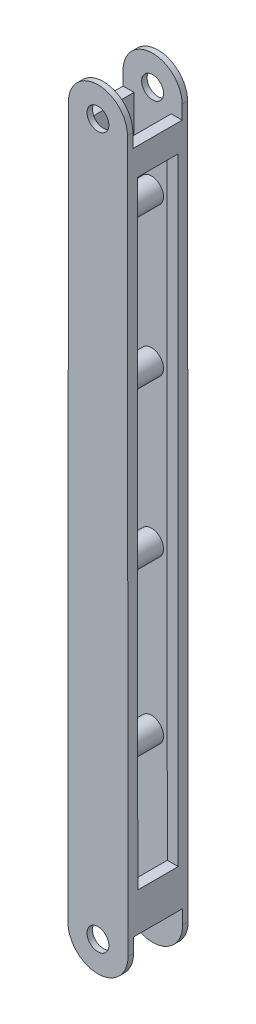
ISO-10303-21;
HEADER;
FILE_DESCRIPTION(('STEP AP214'),'2;1');
FILE_NAME('part.step','',(''),(''),'','','');
FILE_SCHEMA(('AUTOMOTIVE_DESIGN { 1 0 10303 214 1 1 1 1 }'));
ENDSEC;
DATA;
#1=APPLICATION_CONTEXT('core data for automotive mechanical design processes');
#2=APPLICATION_PROTOCOL_DEFINITION('international standard','automotive_design',2000,#1);
#3=PRODUCT_CONTEXT('',#1,'mechanical');
#4=PRODUCT('Part','Part','',(#3));
#5=PRODUCT_RELATED_PRODUCT_CATEGORY('part','',(#4));
#6=PRODUCT_DEFINITION_FORMATION('','',#4);
#7=PRODUCT_DEFINITION_CONTEXT('part definition',#1,'design');
#8=PRODUCT_DEFINITION('design','',#6,#7);
#9=PRODUCT_DEFINITION_SHAPE('','',#8);
#10=(LENGTH_UNIT() NAMED_UNIT(*) SI_UNIT(.MILLI.,.METRE.));
#11=(NAMED_UNIT(*) PLANE_ANGLE_UNIT() SI_UNIT($,.RADIAN.));
#12=(NAMED_UNIT(*) SI_UNIT($,.STERADIAN.) SOLID_ANGLE_UNIT());
#13=UNCERTAINTY_MEASURE_WITH_UNIT(LENGTH_MEASURE(1.E-05),#10,'distance_accuracy_value','');
#14=(GEOMETRIC_REPRESENTATION_CONTEXT(3) GLOBAL_UNCERTAINTY_ASSIGNED_CONTEXT((#13)) GLOBAL_UNIT_ASSIGNED_CONTEXT((#10,
#11,#12)) REPRESENTATION_CONTEXT('',''));
#15=CARTESIAN_POINT('',(0.,0.,0.));
#16=DIRECTION('',(0.,0.,1.));
#17=DIRECTION('',(1.,0.,0.));
#18=AXIS2_PLACEMENT_3D('',#15,#16,#17);
#19=CARTESIAN_POINT('',(17.4999896449765,0.0134615304961336,55.));
#20=DIRECTION('',(-0.999999704142143,-0.000769230541647676,0.));
#21=DIRECTION('',(0.000769230541647677,-0.999999704142143,0.));
#22=AXIS2_PLACEMENT_3D('',#19,#20,#21);
#23=PLANE('',#22);
#24=DIRECTION('',(-0.000769230541647677,0.999999704142143,0.));
#25=VECTOR('',#24,1.);
#26=CARTESIAN_POINT('',(17.4999896449765,0.0134615304961336,46.));
#27=LINE('',#26,#25);
#28=CARTESIAN_POINT('',(17.4628808729569,48.2548651560053,46.));
#29=VERTEX_POINT('',#28);
#30=CARTESIAN_POINT('',(17.0287913508929,612.571243839388,46.));
#31=VERTEX_POINT('',#30);
#32=EDGE_CURVE('E246',#29,#31,#27,.T.);
#33=ORIENTED_EDGE('',*,*,#32,.F.);
#34=DIRECTION('',(0.,0.,1.));
#35=VECTOR('',#34,1.);
#36=CARTESIAN_POINT('',(17.4628808729569,48.2548651560053,55.));
#37=LINE('',#36,#35);
#38=CARTESIAN_POINT('',(17.4628808729569,48.2548651560053,9.00000000000001));
#39=VERTEX_POINT('',#38);
#40=EDGE_CURVE('E212',#39,#29,#37,.T.);
#41=ORIENTED_EDGE('',*,*,#40,.F.);
#42=DIRECTION('',(0.000769230541647677,-0.999999704142143,0.));
#43=VECTOR('',#42,1.);
#44=CARTESIAN_POINT('',(17.4999896449765,0.0134615304961336,9.00000000000001));
#45=LINE('',#44,#43);
#46=CARTESIAN_POINT('',(17.0287913508928,612.571243839388,9.00000000000001));
#47=VERTEX_POINT('',#46);
#48=EDGE_CURVE('E229',#47,#39,#45,.T.);
#49=ORIENTED_EDGE('',*,*,#48,.F.);
#50=DIRECTION('',(0.,0.,-1.));
#51=VECTOR('',#50,1.);
#52=CARTESIAN_POINT('',(17.0287913508929,612.571243839388,55.));
#53=LINE('',#52,#51);
#54=EDGE_CURVE('E239',#31,#47,#53,.T.);
#55=ORIENTED_EDGE('',*,*,#54,.F.);
#56=EDGE_LOOP('',(#33,#41,#49,#55));
#57=FACE_BOUND('',#56,.T.);
#58=DIRECTION('',(0.,0.,-1.));
#59=VECTOR('',#58,1.);
#60=CARTESIAN_POINT('',(17.4900179488838,12.9766664510537,55.));
#61=LINE('',#60,#59);
#62=CARTESIAN_POINT('',(17.4900179488838,12.9766664510537,50.));
#63=VERTEX_POINT('',#62);
#64=CARTESIAN_POINT('',(17.4900179488838,12.9766664510537,5.));
#65=VERTEX_POINT('',#64);
#66=EDGE_CURVE('E322',#63,#65,#61,.T.);
#67=ORIENTED_EDGE('',*,*,#66,.F.);
#68=DIRECTION('',(-0.000769230541647677,0.999999704142143,0.));
#69=VECTOR('',#68,1.);
#70=CARTESIAN_POINT('',(17.4999896449765,0.0134615304961336,50.));
#71=LINE('',#70,#69);
#72=CARTESIAN_POINT('',(17.0096776403332,637.419067566951,50.));
#73=VERTEX_POINT('',#72);
#74=EDGE_CURVE('E291',#63,#73,#71,.T.);
#75=ORIENTED_EDGE('',*,*,#74,.T.);
#76=DIRECTION('',(0.,0.,-1.));
#77=VECTOR('',#76,1.);
#78=CARTESIAN_POINT('',(17.0096776403332,637.419067566951,55.));
#79=LINE('',#78,#77);
#80=CARTESIAN_POINT('',(17.0096776403332,637.419067566951,5.));
#81=VERTEX_POINT('',#80);
#82=EDGE_CURVE('E316',#73,#81,#79,.T.);
#83=ORIENTED_EDGE('',*,*,#82,.T.);
#84=DIRECTION('',(-0.000769230541647677,0.999999704142143,0.));
#85=VECTOR('',#84,1.);
#86=CARTESIAN_POINT('',(17.4999896449765,0.0134615304961336,5.));
#87=LINE('',#86,#85);
#88=EDGE_CURVE('E357',#65,#81,#87,.T.);
#89=ORIENTED_EDGE('',*,*,#88,.F.);
#90=EDGE_LOOP('',(#67,#75,#83,#89));
#91=FACE_BOUND('',#90,.T.);
#92=ADVANCED_FACE('F43',(#57,#91),#23,.T.);
#93=CARTESIAN_POINT('',(0.,12.9766664510537,55.));
#94=DIRECTION('',(0.,-1.,0.));
#95=DIRECTION('',(0.,0.,-1.));
#96=AXIS2_PLACEMENT_3D('',#93,#94,#95);
#97=PLANE('',#96);
#98=DIRECTION('',(0.,0.,-1.));
#99=VECTOR('',#98,1.);
#100=CARTESIAN_POINT('',(27.4900179488838,12.9766664510537,55.));
#101=LINE('',#100,#99);
#102=CARTESIAN_POINT('',(27.4900179488838,12.9766664510537,50.));
#103=VERTEX_POINT('',#102);
#104=CARTESIAN_POINT('',(27.4900179488838,12.9766664510537,5.));
#105=VERTEX_POINT('',#104);
#106=EDGE_CURVE('E320',#103,#105,#101,.T.);
#107=ORIENTED_EDGE('',*,*,#106,.F.);
#108=DIRECTION('',(-1.,0.,0.));
#109=VECTOR('',#108,1.);
#110=CARTESIAN_POINT('',(0.,12.9766664510537,50.));
#111=LINE('',#110,#109);
#112=EDGE_CURVE('E288',#103,#63,#111,.T.);
#113=ORIENTED_EDGE('',*,*,#112,.T.);
#114=ORIENTED_EDGE('',*,*,#66,.T.);
#115=DIRECTION('',(-1.,0.,0.));
#116=VECTOR('',#115,1.);
#117=CARTESIAN_POINT('',(0.,12.9766664510537,5.));
#118=LINE('',#117,#116);
#119=EDGE_CURVE('E354',#105,#65,#118,.T.);
#120=ORIENTED_EDGE('',*,*,#119,.F.);
#121=EDGE_LOOP('',(#107,#113,#114,#120));
#122=FACE_BOUND('',#121,.T.);
#123=ADVANCED_FACE('F488',(#122),#97,.T.);
#124=CARTESIAN_POINT('',(0.,637.419067566951,55.));
#125=DIRECTION('',(0.,-1.,0.));
#126=DIRECTION('',(0.,0.,-1.));
#127=AXIS2_PLACEMENT_3D('',#124,#125,#126);
#128=PLANE('',#127);
#129=DIRECTION('',(-1.,0.,0.));
#130=VECTOR('',#129,1.);
#131=CARTESIAN_POINT('',(0.,637.419067566951,50.));
#132=LINE('',#131,#130);
#133=CARTESIAN_POINT('',(27.0096776403331,637.419067566951,50.));
#134=VERTEX_POINT('',#133);
#135=EDGE_CURVE('E253',#134,#73,#132,.T.);
#136=ORIENTED_EDGE('',*,*,#135,.F.);
#137=DIRECTION('',(0.,0.,-1.));
#138=VECTOR('',#137,1.);
#139=CARTESIAN_POINT('',(27.0096776403331,637.419067566951,55.));
#140=LINE('',#139,#138);
#141=CARTESIAN_POINT('',(27.0096776403331,637.419067566951,5.));
#142=VERTEX_POINT('',#141);
#143=EDGE_CURVE('E318',#134,#142,#140,.T.);
#144=ORIENTED_EDGE('',*,*,#143,.T.);
#145=DIRECTION('',(-1.,0.,0.));
#146=VECTOR('',#145,1.);
#147=CARTESIAN_POINT('',(0.,637.419067566951,5.));
#148=LINE('',#147,#146);
#149=EDGE_CURVE('E360',#142,#81,#148,.T.);
#150=ORIENTED_EDGE('',*,*,#149,.T.);
#151=ORIENTED_EDGE('',*,*,#82,.F.);
#152=EDGE_LOOP('',(#136,#144,#150,#151));
#153=FACE_BOUND('',#152,.T.);
#154=ADVANCED_FACE('F478',(#153),#128,.F.);
#155=CARTESIAN_POINT('',(0.,637.419067566951,55.));
#156=DIRECTION('',(0.,1.,0.));
#157=DIRECTION('',(0.,0.,1.));
#158=AXIS2_PLACEMENT_3D('',#155,#156,#157);
#159=PLANE('',#158);
#160=DIRECTION('',(0.,0.,-1.));
#161=VECTOR('',#160,1.);
#162=CARTESIAN_POINT('',(-27.0096776403331,637.419067566951,55.));
#163=LINE('',#162,#161);
#164=CARTESIAN_POINT('',(-27.0096776403331,637.419067566951,50.));
#165=VERTEX_POINT('',#164);
#166=CARTESIAN_POINT('',(-27.0096776403331,637.419067566951,5.));
#167=VERTEX_POINT('',#166);
#168=EDGE_CURVE('E312',#165,#167,#163,.T.);
#169=ORIENTED_EDGE('',*,*,#168,.F.);
#170=DIRECTION('',(1.,0.,0.));
#171=VECTOR('',#170,1.);
#172=CARTESIAN_POINT('',(0.,637.419067566951,50.));
#173=LINE('',#172,#171);
#174=CARTESIAN_POINT('',(-17.0096776403332,637.419067566951,50.));
#175=VERTEX_POINT('',#174);
#176=EDGE_CURVE('E277',#165,#175,#173,.T.);
#177=ORIENTED_EDGE('',*,*,#176,.T.);
#178=DIRECTION('',(0.,0.,-1.));
#179=VECTOR('',#178,1.);
#180=CARTESIAN_POINT('',(-17.0096776403332,637.419067566951,55.));
#181=LINE('',#180,#179);
#182=CARTESIAN_POINT('',(-17.0096776403332,637.419067566951,5.));
#183=VERTEX_POINT('',#182);
#184=EDGE_CURVE('E306',#175,#183,#181,.T.);
#185=ORIENTED_EDGE('',*,*,#184,.T.);
#186=DIRECTION('',(1.,0.,0.));
#187=VECTOR('',#186,1.);
#188=CARTESIAN_POINT('',(0.,637.419067566951,5.));
#189=LINE('',#188,#187);
#190=EDGE_CURVE('E342',#167,#183,#189,.T.);
#191=ORIENTED_EDGE('',*,*,#190,.F.);
#192=EDGE_LOOP('',(#169,#177,#185,#191));
#193=FACE_BOUND('',#192,.T.);
#194=ADVANCED_FACE('F510',(#193),#159,.T.);
#195=CARTESIAN_POINT('',(0.,12.9766664510537,55.));
#196=DIRECTION('',(0.,1.,0.));
#197=DIRECTION('',(0.,0.,1.));
#198=AXIS2_PLACEMENT_3D('',#195,#196,#197);
#199=PLANE('',#198);
#200=DIRECTION('',(1.,0.,0.));
#201=VECTOR('',#200,1.);
#202=CARTESIAN_POINT('',(0.,12.9766664510537,50.));
#203=LINE('',#202,#201);
#204=CARTESIAN_POINT('',(-27.4900179488838,12.9766664510537,50.));
#205=VERTEX_POINT('',#204);
#206=CARTESIAN_POINT('',(-17.4900179488838,12.9766664510537,50.));
#207=VERTEX_POINT('',#206);
#208=EDGE_CURVE('E283',#205,#207,#203,.T.);
#209=ORIENTED_EDGE('',*,*,#208,.F.);
#210=DIRECTION('',(0.,0.,-1.));
#211=VECTOR('',#210,1.);
#212=CARTESIAN_POINT('',(-27.4900179488838,12.9766664510537,55.));
#213=LINE('',#212,#211);
#214=CARTESIAN_POINT('',(-27.4900179488838,12.9766664510537,5.));
#215=VERTEX_POINT('',#214);
#216=EDGE_CURVE('E310',#205,#215,#213,.T.);
#217=ORIENTED_EDGE('',*,*,#216,.T.);
#218=DIRECTION('',(1.,0.,0.));
#219=VECTOR('',#218,1.);
#220=CARTESIAN_POINT('',(0.,12.9766664510537,5.));
#221=LINE('',#220,#219);
#222=CARTESIAN_POINT('',(-17.4900179488838,12.9766664510537,5.));
#223=VERTEX_POINT('',#222);
#224=EDGE_CURVE('E349',#215,#223,#221,.T.);
#225=ORIENTED_EDGE('',*,*,#224,.T.);
#226=DIRECTION('',(0.,0.,-1.));
#227=VECTOR('',#226,1.);
#228=CARTESIAN_POINT('',(-17.4900179488838,12.9766664510537,55.));
#229=LINE('',#228,#227);
#230=EDGE_CURVE('E308',#207,#223,#229,.T.);
#231=ORIENTED_EDGE('',*,*,#230,.F.);
#232=EDGE_LOOP('',(#209,#217,#225,#231));
#233=FACE_BOUND('',#232,.T.);
#234=ADVANCED_FACE('F503',(#233),#199,.F.);
#235=CARTESIAN_POINT('',(-17.4999896449765,0.0134615304961336,55.));
#236=DIRECTION('',(-0.999999704142143,0.000769230541647676,0.));
#237=DIRECTION('',(-0.000769230541647677,-0.999999704142143,0.));
#238=AXIS2_PLACEMENT_3D('',#235,#236,#237);
#239=PLANE('',#238);
#240=DIRECTION('',(0.,0.,1.));
#241=VECTOR('',#240,1.);
#242=CARTESIAN_POINT('',(-17.4629015391004,48.2279991695345,55.));
#243=LINE('',#242,#241);
#244=CARTESIAN_POINT('',(-17.4629015391004,48.2279991695345,9.00000000000001));
#245=VERTEX_POINT('',#244);
#246=CARTESIAN_POINT('',(-17.4629015391004,48.2279991695345,46.));
#247=VERTEX_POINT('',#246);
#248=EDGE_CURVE('E204',#245,#247,#243,.T.);
#249=ORIENTED_EDGE('',*,*,#248,.T.);
#250=DIRECTION('',(0.000769230541647677,0.999999704142143,0.));
#251=VECTOR('',#250,1.);
#252=CARTESIAN_POINT('',(-17.4999896449765,0.0134615304961336,46.));
#253=LINE('',#252,#251);
#254=CARTESIAN_POINT('',(-17.0288115033206,612.545045683346,46.));
#255=VERTEX_POINT('',#254);
#256=EDGE_CURVE('E244',#247,#255,#253,.T.);
#257=ORIENTED_EDGE('',*,*,#256,.T.);
#258=DIRECTION('',(0.,0.,-1.));
#259=VECTOR('',#258,1.);
#260=CARTESIAN_POINT('',(-17.0288115033206,612.545045683346,55.));
#261=LINE('',#260,#259);
#262=CARTESIAN_POINT('',(-17.0288115033206,612.545045683346,9.00000000000001));
#263=VERTEX_POINT('',#262);
#264=EDGE_CURVE('E228',#255,#263,#261,.T.);
#265=ORIENTED_EDGE('',*,*,#264,.T.);
#266=DIRECTION('',(-0.000769230541647677,-0.999999704142143,0.));
#267=VECTOR('',#266,1.);
#268=CARTESIAN_POINT('',(-17.4999896449765,0.0134615304961336,9.00000000000001));
#269=LINE('',#268,#267);
#270=EDGE_CURVE('E218',#263,#245,#269,.T.);
#271=ORIENTED_EDGE('',*,*,#270,.T.);
#272=EDGE_LOOP('',(#249,#257,#265,#271));
#273=FACE_BOUND('',#272,.T.);
#274=DIRECTION('',(0.000769230541647677,0.999999704142143,0.));
#275=VECTOR('',#274,1.);
#276=CARTESIAN_POINT('',(-17.4999896449765,0.0134615304961336,50.));
#277=LINE('',#276,#275);
#278=EDGE_CURVE('E281',#207,#175,#277,.T.);
#279=ORIENTED_EDGE('',*,*,#278,.F.);
#280=ORIENTED_EDGE('',*,*,#230,.T.);
#281=DIRECTION('',(0.000769230541647677,0.999999704142143,0.));
#282=VECTOR('',#281,1.);
#283=CARTESIAN_POINT('',(-17.4999896449765,0.0134615304961336,5.));
#284=LINE('',#283,#282);
#285=EDGE_CURVE('E346',#223,#183,#284,.T.);
#286=ORIENTED_EDGE('',*,*,#285,.T.);
#287=ORIENTED_EDGE('',*,*,#184,.F.);
#288=EDGE_LOOP('',(#279,#280,#286,#287));
#289=FACE_BOUND('',#288,.T.);
#290=ADVANCED_FACE('F226',(#273,#289),#239,.F.);
#291=CARTESIAN_POINT('',(0.,650.,5.));
#292=DIRECTION('',(0.,0.,-1.));
#293=DIRECTION('',(-1.,0.,0.));
#294=AXIS2_PLACEMENT_3D('',#291,#292,#293);
#295=CYLINDRICAL_SURFACE('',#294,27.);
#296=CARTESIAN_POINT('',(0.,650.,0.));
#297=DIRECTION('',(0.,0.,1.));
#298=DIRECTION('',(1.,0.,0.));
#299=AXIS2_PLACEMENT_3D('',#296,#297,#298);
#300=CIRCLE('',#299,27.);
#301=CARTESIAN_POINT('',(27.,650.,0.));
#302=VERTEX_POINT('',#301);
#303=CARTESIAN_POINT('',(-27.,650.,0.));
#304=VERTEX_POINT('',#303);
#305=EDGE_CURVE('E369',#302,#304,#300,.T.);
#306=ORIENTED_EDGE('',*,*,#305,.T.);
#307=DIRECTION('',(0.,0.,-1.));
#308=VECTOR('',#307,1.);
#309=CARTESIAN_POINT('',(-27.,650.,5.));
#310=LINE('',#309,#308);
#311=CARTESIAN_POINT('',(-27.,650.,5.));
#312=VERTEX_POINT('',#311);
#313=EDGE_CURVE('E384',#312,#304,#310,.T.);
#314=ORIENTED_EDGE('',*,*,#313,.F.);
#315=CARTESIAN_POINT('',(0.,650.,5.));
#316=DIRECTION('',(0.,0.,1.));
#317=DIRECTION('',(1.,0.,0.));
#318=AXIS2_PLACEMENT_3D('',#315,#316,#317);
#319=CIRCLE('',#318,27.);
#320=CARTESIAN_POINT('',(27.,650.,5.));
#321=VERTEX_POINT('',#320);
#322=EDGE_CURVE('E335',#321,#312,#319,.T.);
#323=ORIENTED_EDGE('',*,*,#322,.F.);
#324=DIRECTION('',(0.,0.,-1.));
#325=VECTOR('',#324,1.);
#326=CARTESIAN_POINT('',(27.,650.,5.));
#327=LINE('',#326,#325);
#328=EDGE_CURVE('E387',#321,#302,#327,.T.);
#329=ORIENTED_EDGE('',*,*,#328,.T.);
#330=EDGE_LOOP('',(#306,#314,#323,#329));
#331=FACE_BOUND('',#330,.T.);
#332=ADVANCED_FACE('F461',(#331),#295,.T.);
#333=CARTESIAN_POINT('',(-27.4999837278203,0.0211538336367847,5.));
#334=DIRECTION('',(0.999999704142143,-0.000769230541647798,0.));
#335=DIRECTION('',(0.000769230541647798,0.999999704142143,0.));
#336=AXIS2_PLACEMENT_3D('',#333,#334,#335);
#337=PLANE('',#336);
#338=DIRECTION('',(0.,0.,1.));
#339=VECTOR('',#338,1.);
#340=CARTESIAN_POINT('',(-27.0288174204838,612.537353371102,5.));
#341=LINE('',#340,#339);
#342=CARTESIAN_POINT('',(-27.0288174204838,612.537353371102,9.00000000000001));
#343=VERTEX_POINT('',#342);
#344=CARTESIAN_POINT('',(-27.0288174204838,612.537353371102,46.));
#345=VERTEX_POINT('',#344);
#346=EDGE_CURVE('E231',#343,#345,#341,.T.);
#347=ORIENTED_EDGE('',*,*,#346,.T.);
#348=DIRECTION('',(-0.000769230541647798,-0.999999704142143,0.));
#349=VECTOR('',#348,1.);
#350=CARTESIAN_POINT('',(-27.4999837278203,0.0211538336367847,46.));
#351=LINE('',#350,#349);
#352=CARTESIAN_POINT('',(-27.4629074562636,48.2203068572905,46.));
#353=VERTEX_POINT('',#352);
#354=EDGE_CURVE('E241',#345,#353,#351,.T.);
#355=ORIENTED_EDGE('',*,*,#354,.T.);
#356=DIRECTION('',(0.,0.,-1.));
#357=VECTOR('',#356,1.);
#358=CARTESIAN_POINT('',(-27.4629074562636,48.2203068572905,5.));
#359=LINE('',#358,#357);
#360=CARTESIAN_POINT('',(-27.4629074562636,48.2203068572905,9.00000000000001));
#361=VERTEX_POINT('',#360);
#362=EDGE_CURVE('E213',#353,#361,#359,.T.);
#363=ORIENTED_EDGE('',*,*,#362,.T.);
#364=DIRECTION('',(0.000769230541647798,0.999999704142143,0.));
#365=VECTOR('',#364,1.);
#366=CARTESIAN_POINT('',(-27.4999837278203,0.0211538336367847,9.00000000000001));
#367=LINE('',#366,#365);
#368=EDGE_CURVE('E221',#361,#343,#367,.T.);
#369=ORIENTED_EDGE('',*,*,#368,.T.);
#370=EDGE_LOOP('',(#347,#355,#363,#369));
#371=FACE_BOUND('',#370,.T.);
#372=DIRECTION('',(-0.000769230541647798,-0.999999704142143,0.));
#373=VECTOR('',#372,1.);
#374=CARTESIAN_POINT('',(-27.4999837278203,0.0211538336367847,0.));
#375=LINE('',#374,#373);
#376=CARTESIAN_POINT('',(-27.5,0.,0.));
#377=VERTEX_POINT('',#376);
#378=EDGE_CURVE('E375',#304,#377,#375,.T.);
#379=ORIENTED_EDGE('',*,*,#378,.T.);
#380=DIRECTION('',(0.,0.,-1.));
#381=VECTOR('',#380,1.);
#382=CARTESIAN_POINT('',(-27.5,0.,5.));
#383=LINE('',#382,#381);
#384=CARTESIAN_POINT('',(-27.5,0.,5.));
#385=VERTEX_POINT('',#384);
#386=EDGE_CURVE('E381',#385,#377,#383,.T.);
#387=ORIENTED_EDGE('',*,*,#386,.F.);
#388=DIRECTION('',(-0.000769230541647798,-0.999999704142143,0.));
#389=VECTOR('',#388,1.);
#390=CARTESIAN_POINT('',(-27.4999837278203,0.0211538336367847,5.));
#391=LINE('',#390,#389);
#392=EDGE_CURVE('E343',#215,#385,#391,.T.);
#393=ORIENTED_EDGE('',*,*,#392,.F.);
#394=ORIENTED_EDGE('',*,*,#216,.F.);
#395=DIRECTION('',(-0.000769230541647798,-0.999999704142143,0.));
#396=VECTOR('',#395,1.);
#397=CARTESIAN_POINT('',(-27.4999837278203,0.0211538336367847,50.));
#398=LINE('',#397,#396);
#399=CARTESIAN_POINT('',(-27.5,0.,50.));
#400=VERTEX_POINT('',#399);
#401=EDGE_CURVE('E278',#205,#400,#398,.T.);
#402=ORIENTED_EDGE('',*,*,#401,.T.);
#403=DIRECTION('',(0.,0.,-1.));
#404=VECTOR('',#403,1.);
#405=CARTESIAN_POINT('',(-27.5,0.,55.));
#406=LINE('',#405,#404);
#407=CARTESIAN_POINT('',(-27.5,0.,55.));
#408=VERTEX_POINT('',#407);
#409=EDGE_CURVE('E296',#408,#400,#406,.T.);
#410=ORIENTED_EDGE('',*,*,#409,.F.);
#411=DIRECTION('',(-0.000769230541647798,-0.999999704142143,0.));
#412=VECTOR('',#411,1.);
#413=CARTESIAN_POINT('',(-27.4999837278203,0.0211538336367847,55.));
#414=LINE('',#413,#412);
#415=CARTESIAN_POINT('',(-27.,650.,55.));
#416=VERTEX_POINT('',#415);
#417=EDGE_CURVE('E304',#416,#408,#414,.T.);
#418=ORIENTED_EDGE('',*,*,#417,.F.);
#419=DIRECTION('',(0.,0.,-1.));
#420=VECTOR('',#419,1.);
#421=CARTESIAN_POINT('',(-27.,650.,55.));
#422=LINE('',#421,#420);
#423=CARTESIAN_POINT('',(-27.,650.,50.));
#424=VERTEX_POINT('',#423);
#425=EDGE_CURVE('E299',#416,#424,#422,.T.);
#426=ORIENTED_EDGE('',*,*,#425,.T.);
#427=EDGE_CURVE('E274',#424,#165,#398,.T.);
#428=ORIENTED_EDGE('',*,*,#427,.T.);
#429=ORIENTED_EDGE('',*,*,#168,.T.);
#430=EDGE_CURVE('E339',#312,#167,#391,.T.);
#431=ORIENTED_EDGE('',*,*,#430,.F.);
#432=ORIENTED_EDGE('',*,*,#313,.T.);
#433=EDGE_LOOP('',(#379,#387,#393,#394,#402,#410,#418,#426,#428,#429,#431,#432));
#434=FACE_BOUND('',#433,.T.);
#435=ADVANCED_FACE('F467',(#371,#434),#337,.F.);
#436=CARTESIAN_POINT('',(0.,0.,5.));
#437=DIRECTION('',(0.,0.,-1.));
#438=DIRECTION('',(-1.,0.,0.));
#439=AXIS2_PLACEMENT_3D('',#436,#437,#438);
#440=CYLINDRICAL_SURFACE('',#439,27.5);
#441=CARTESIAN_POINT('',(0.,0.,0.));
#442=DIRECTION('',(0.,0.,1.));
#443=DIRECTION('',(1.,0.,0.));
#444=AXIS2_PLACEMENT_3D('',#441,#442,#443);
#445=CIRCLE('',#444,27.5);
#446=CARTESIAN_POINT('',(27.5,0.,0.));
#447=VERTEX_POINT('',#446);
#448=EDGE_CURVE('E372',#377,#447,#445,.T.);
#449=ORIENTED_EDGE('',*,*,#448,.T.);
#450=DIRECTION('',(0.,0.,-1.));
#451=VECTOR('',#450,1.);
#452=CARTESIAN_POINT('',(27.5,0.,5.));
#453=LINE('',#452,#451);
#454=CARTESIAN_POINT('',(27.5,0.,5.));
#455=VERTEX_POINT('',#454);
#456=EDGE_CURVE('E363',#455,#447,#453,.T.);
#457=ORIENTED_EDGE('',*,*,#456,.F.);
#458=CARTESIAN_POINT('',(0.,0.,5.));
#459=DIRECTION('',(0.,0.,1.));
#460=DIRECTION('',(1.,0.,0.));
#461=AXIS2_PLACEMENT_3D('',#458,#459,#460);
#462=CIRCLE('',#461,27.5);
#463=EDGE_CURVE('E352',#385,#455,#462,.T.);
#464=ORIENTED_EDGE('',*,*,#463,.F.);
#465=ORIENTED_EDGE('',*,*,#386,.T.);
#466=EDGE_LOOP('',(#449,#457,#464,#465));
#467=FACE_BOUND('',#466,.T.);
#468=ADVANCED_FACE('F453',(#467),#440,.T.);
#469=CARTESIAN_POINT('',(27.4999837278203,0.0211538336367847,5.));
#470=DIRECTION('',(0.999999704142143,0.000769230541647798,0.));
#471=DIRECTION('',(-0.000769230541647798,0.999999704142143,0.));
#472=AXIS2_PLACEMENT_3D('',#469,#470,#471);
#473=PLANE('',#472);
#474=DIRECTION('',(0.000769230541647798,-0.999999704142143,0.));
#475=VECTOR('',#474,1.);
#476=CARTESIAN_POINT('',(27.4999837278203,0.0211538336367847,46.));
#477=LINE('',#476,#475);
#478=CARTESIAN_POINT('',(27.0287854337365,612.578936142528,46.));
#479=VERTEX_POINT('',#478);
#480=CARTESIAN_POINT('',(27.4628749558007,48.2625574591459,46.));
#481=VERTEX_POINT('',#480);
#482=EDGE_CURVE('E11',#479,#481,#477,.T.);
#483=ORIENTED_EDGE('',*,*,#482,.F.);
#484=DIRECTION('',(0.,0.,1.));
#485=VECTOR('',#484,1.);
#486=CARTESIAN_POINT('',(27.0287854337365,612.578936142528,5.));
#487=LINE('',#486,#485);
#488=CARTESIAN_POINT('',(27.0287854337365,612.578936142529,9.00000000000001));
#489=VERTEX_POINT('',#488);
#490=EDGE_CURVE('E52',#489,#479,#487,.T.);
#491=ORIENTED_EDGE('',*,*,#490,.F.);
#492=DIRECTION('',(-0.000769230541647798,0.999999704142143,0.));
#493=VECTOR('',#492,1.);
#494=CARTESIAN_POINT('',(27.4999837278203,0.0211538336367847,9.00000000000001));
#495=LINE('',#494,#493);
#496=CARTESIAN_POINT('',(27.4628749558007,48.2625574591459,9.00000000000001));
#497=VERTEX_POINT('',#496);
#498=EDGE_CURVE('E392',#497,#489,#495,.T.);
#499=ORIENTED_EDGE('',*,*,#498,.F.);
#500=DIRECTION('',(0.,0.,-1.));
#501=VECTOR('',#500,1.);
#502=CARTESIAN_POINT('',(27.4628749558007,48.2625574591459,5.));
#503=LINE('',#502,#501);
#504=EDGE_CURVE('E390',#481,#497,#503,.T.);
#505=ORIENTED_EDGE('',*,*,#504,.F.);
#506=EDGE_LOOP('',(#483,#491,#499,#505));
#507=FACE_BOUND('',#506,.T.);
#508=DIRECTION('',(0.000769230541647798,-0.999999704142143,0.));
#509=VECTOR('',#508,1.);
#510=CARTESIAN_POINT('',(27.4999837278203,0.0211538336367847,0.));
#511=LINE('',#510,#509);
#512=EDGE_CURVE('E329',#302,#447,#511,.T.);
#513=ORIENTED_EDGE('',*,*,#512,.F.);
#514=ORIENTED_EDGE('',*,*,#328,.F.);
#515=DIRECTION('',(0.000769230541647798,-0.999999704142143,0.));
#516=VECTOR('',#515,1.);
#517=CARTESIAN_POINT('',(27.4999837278203,0.0211538336367847,5.));
#518=LINE('',#517,#516);
#519=EDGE_CURVE('E332',#321,#142,#518,.T.);
#520=ORIENTED_EDGE('',*,*,#519,.T.);
#521=ORIENTED_EDGE('',*,*,#143,.F.);
#522=DIRECTION('',(0.000769230541647798,-0.999999704142143,0.));
#523=VECTOR('',#522,1.);
#524=CARTESIAN_POINT('',(27.4999837278203,0.0211538336367847,50.));
#525=LINE('',#524,#523);
#526=CARTESIAN_POINT('',(27.,650.,50.));
#527=VERTEX_POINT('',#526);
#528=EDGE_CURVE('E268',#527,#134,#525,.T.);
#529=ORIENTED_EDGE('',*,*,#528,.F.);
#530=DIRECTION('',(0.,0.,-1.));
#531=VECTOR('',#530,1.);
#532=CARTESIAN_POINT('',(27.,650.,55.));
#533=LINE('',#532,#531);
#534=CARTESIAN_POINT('',(27.,650.,55.));
#535=VERTEX_POINT('',#534);
#536=EDGE_CURVE('E302',#535,#527,#533,.T.);
#537=ORIENTED_EDGE('',*,*,#536,.F.);
#538=DIRECTION('',(0.000769230541647798,-0.999999704142143,0.));
#539=VECTOR('',#538,1.);
#540=CARTESIAN_POINT('',(27.4999837278203,0.0211538336367847,55.));
#541=LINE('',#540,#539);
#542=CARTESIAN_POINT('',(27.5,0.,55.));
#543=VERTEX_POINT('',#542);
#544=EDGE_CURVE('E314',#535,#543,#541,.T.);
#545=ORIENTED_EDGE('',*,*,#544,.T.);
#546=DIRECTION('',(0.,0.,-1.));
#547=VECTOR('',#546,1.);
#548=CARTESIAN_POINT('',(27.5,0.,55.));
#549=LINE('',#548,#547);
#550=CARTESIAN_POINT('',(27.5,0.,50.));
#551=VERTEX_POINT('',#550);
#552=EDGE_CURVE('E262',#543,#551,#549,.T.);
#553=ORIENTED_EDGE('',*,*,#552,.T.);
#554=EDGE_CURVE('E271',#103,#551,#525,.T.);
#555=ORIENTED_EDGE('',*,*,#554,.F.);
#556=ORIENTED_EDGE('',*,*,#106,.T.);
#557=EDGE_CURVE('E336',#105,#455,#518,.T.);
#558=ORIENTED_EDGE('',*,*,#557,.T.);
#559=ORIENTED_EDGE('',*,*,#456,.T.);
#560=EDGE_LOOP('',(#513,#514,#520,#521,#529,#537,#545,#553,#555,#556,#558,#559));
#561=FACE_BOUND('',#560,.T.);
#562=ADVANCED_FACE('F449',(#507,#561),#473,.T.);
#563=CARTESIAN_POINT('',(0.,0.,5.));
#564=DIRECTION('',(0.,0.,-1.));
#565=DIRECTION('',(-1.,0.,0.));
#566=AXIS2_PLACEMENT_3D('',#563,#564,#565);
#567=CYLINDRICAL_SURFACE('',#566,10.);
#568=CARTESIAN_POINT('',(0.,0.,5.));
#569=DIRECTION('',(0.,0.,1.));
#570=DIRECTION('',(1.,0.,0.));
#571=AXIS2_PLACEMENT_3D('',#568,#569,#570);
#572=CIRCLE('',#571,10.);
#573=CARTESIAN_POINT('',(10.,0.,5.));
#574=VERTEX_POINT('',#573);
#575=EDGE_CURVE('E328',#574,#574,#572,.T.);
#576=ORIENTED_EDGE('',*,*,#575,.T.);
#577=EDGE_LOOP('',(#576));
#578=FACE_BOUND('',#577,.T.);
#579=CARTESIAN_POINT('',(0.,0.,0.));
#580=DIRECTION('',(0.,0.,1.));
#581=DIRECTION('',(1.,0.,0.));
#582=AXIS2_PLACEMENT_3D('',#579,#580,#581);
#583=CIRCLE('',#582,10.);
#584=CARTESIAN_POINT('',(10.,0.,0.));
#585=VERTEX_POINT('',#584);
#586=EDGE_CURVE('E366',#585,#585,#583,.T.);
#587=ORIENTED_EDGE('',*,*,#586,.F.);
#588=EDGE_LOOP('',(#587));
#589=FACE_BOUND('',#588,.T.);
#590=ADVANCED_FACE('F452',(#578,#589),#567,.F.);
#591=CARTESIAN_POINT('',(0.,650.,5.));
#592=DIRECTION('',(0.,0.,-1.));
#593=DIRECTION('',(-1.,0.,0.));
#594=AXIS2_PLACEMENT_3D('',#591,#592,#593);
#595=CYLINDRICAL_SURFACE('',#594,10.);
#596=CARTESIAN_POINT('',(0.,650.,5.));
#597=DIRECTION('',(0.,0.,1.));
#598=DIRECTION('',(1.,0.,0.));
#599=AXIS2_PLACEMENT_3D('',#596,#597,#598);
#600=CIRCLE('',#599,10.);
#601=CARTESIAN_POINT('',(10.,650.,5.));
#602=VERTEX_POINT('',#601);
#603=EDGE_CURVE('E325',#602,#602,#600,.T.);
#604=ORIENTED_EDGE('',*,*,#603,.T.);
#605=EDGE_LOOP('',(#604));
#606=FACE_BOUND('',#605,.T.);
#607=CARTESIAN_POINT('',(0.,650.,0.));
#608=DIRECTION('',(0.,0.,1.));
#609=DIRECTION('',(1.,0.,0.));
#610=AXIS2_PLACEMENT_3D('',#607,#608,#609);
#611=CIRCLE('',#610,10.);
#612=CARTESIAN_POINT('',(10.,650.,0.));
#613=VERTEX_POINT('',#612);
#614=EDGE_CURVE('E324',#613,#613,#611,.T.);
#615=ORIENTED_EDGE('',*,*,#614,.F.);
#616=EDGE_LOOP('',(#615));
#617=FACE_BOUND('',#616,.T.);
#618=ADVANCED_FACE('F45',(#606,#617),#595,.F.);
#619=CARTESIAN_POINT('',(0.,0.,5.));
#620=DIRECTION('',(0.,0.,1.));
#621=DIRECTION('',(1.,0.,0.));
#622=AXIS2_PLACEMENT_3D('',#619,#620,#621);
#623=PLANE('',#622);
#624=ORIENTED_EDGE('',*,*,#603,.F.);
#625=EDGE_LOOP('',(#624));
#626=FACE_BOUND('',#625,.T.);
#627=ORIENTED_EDGE('',*,*,#575,.F.);
#628=EDGE_LOOP('',(#627));
#629=FACE_BOUND('',#628,.T.);
#630=ORIENTED_EDGE('',*,*,#519,.F.);
#631=ORIENTED_EDGE('',*,*,#322,.T.);
#632=ORIENTED_EDGE('',*,*,#430,.T.);
#633=ORIENTED_EDGE('',*,*,#190,.T.);
#634=ORIENTED_EDGE('',*,*,#285,.F.);
#635=ORIENTED_EDGE('',*,*,#224,.F.);
#636=ORIENTED_EDGE('',*,*,#392,.T.);
#637=ORIENTED_EDGE('',*,*,#463,.T.);
#638=ORIENTED_EDGE('',*,*,#557,.F.);
#639=ORIENTED_EDGE('',*,*,#119,.T.);
#640=ORIENTED_EDGE('',*,*,#88,.T.);
#641=ORIENTED_EDGE('',*,*,#149,.F.);
#642=EDGE_LOOP('',(#630,#631,#632,#633,#634,#635,#636,#637,#638,#639,#640,#641));
#643=FACE_BOUND('',#642,.T.);
#644=ADVANCED_FACE('F471',(#626,#629,#643),#623,.T.);
#645=CARTESIAN_POINT('',(0.,0.,0.));
#646=DIRECTION('',(0.,0.,1.));
#647=DIRECTION('',(1.,0.,0.));
#648=AXIS2_PLACEMENT_3D('',#645,#646,#647);
#649=PLANE('',#648);
#650=ORIENTED_EDGE('',*,*,#614,.T.);
#651=EDGE_LOOP('',(#650));
#652=FACE_BOUND('',#651,.T.);
#653=ORIENTED_EDGE('',*,*,#586,.T.);
#654=EDGE_LOOP('',(#653));
#655=FACE_BOUND('',#654,.T.);
#656=ORIENTED_EDGE('',*,*,#305,.F.);
#657=ORIENTED_EDGE('',*,*,#512,.T.);
#658=ORIENTED_EDGE('',*,*,#448,.F.);
#659=ORIENTED_EDGE('',*,*,#378,.F.);
#660=EDGE_LOOP('',(#656,#657,#658,#659));
#661=FACE_BOUND('',#660,.T.);
#662=ADVANCED_FACE('F464',(#652,#655,#661),#649,.F.);
#663=CARTESIAN_POINT('',(0.,0.,55.));
#664=DIRECTION('',(0.,0.,1.));
#665=DIRECTION('',(1.,0.,0.));
#666=AXIS2_PLACEMENT_3D('',#663,#664,#665);
#667=PLANE('',#666);
#668=CARTESIAN_POINT('',(0.,0.,55.));
#669=DIRECTION('',(0.,0.,1.));
#670=DIRECTION('',(1.,0.,0.));
#671=AXIS2_PLACEMENT_3D('',#668,#669,#670);
#672=CIRCLE('',#671,27.5);
#673=EDGE_CURVE('E259',#408,#543,#672,.T.);
#674=ORIENTED_EDGE('',*,*,#673,.T.);
#675=ORIENTED_EDGE('',*,*,#544,.F.);
#676=CARTESIAN_POINT('',(0.,650.,55.));
#677=DIRECTION('',(0.,0.,1.));
#678=DIRECTION('',(1.,0.,0.));
#679=AXIS2_PLACEMENT_3D('',#676,#677,#678);
#680=CIRCLE('',#679,27.);
#681=EDGE_CURVE('E256',#535,#416,#680,.T.);
#682=ORIENTED_EDGE('',*,*,#681,.T.);
#683=ORIENTED_EDGE('',*,*,#417,.T.);
#684=EDGE_LOOP('',(#674,#675,#682,#683));
#685=FACE_BOUND('',#684,.T.);
#686=CARTESIAN_POINT('',(0.,650.,55.));
#687=DIRECTION('',(0.,0.,1.));
#688=DIRECTION('',(1.,0.,0.));
#689=AXIS2_PLACEMENT_3D('',#686,#687,#688);
#690=CIRCLE('',#689,10.);
#691=CARTESIAN_POINT('',(10.,650.,55.));
#692=VERTEX_POINT('',#691);
#693=EDGE_CURVE('E249',#692,#692,#690,.T.);
#694=ORIENTED_EDGE('',*,*,#693,.F.);
#695=EDGE_LOOP('',(#694));
#696=FACE_BOUND('',#695,.T.);
#697=CARTESIAN_POINT('',(0.,0.,55.));
#698=DIRECTION('',(0.,0.,1.));
#699=DIRECTION('',(1.,0.,0.));
#700=AXIS2_PLACEMENT_3D('',#697,#698,#699);
#701=CIRCLE('',#700,10.);
#702=CARTESIAN_POINT('',(10.,0.,55.));
#703=VERTEX_POINT('',#702);
#704=EDGE_CURVE('E252',#703,#703,#701,.T.);
#705=ORIENTED_EDGE('',*,*,#704,.F.);
#706=EDGE_LOOP('',(#705));
#707=FACE_BOUND('',#706,.T.);
#708=ADVANCED_FACE('F533',(#685,#696,#707),#667,.T.);
#709=CARTESIAN_POINT('',(0.,650.,55.));
#710=DIRECTION('',(0.,0.,-1.));
#711=DIRECTION('',(-1.,0.,0.));
#712=AXIS2_PLACEMENT_3D('',#709,#710,#711);
#713=CYLINDRICAL_SURFACE('',#712,27.);
#714=CARTESIAN_POINT('',(0.,650.,50.));
#715=DIRECTION('',(0.,0.,1.));
#716=DIRECTION('',(1.,0.,0.));
#717=AXIS2_PLACEMENT_3D('',#714,#715,#716);
#718=CIRCLE('',#717,27.);
#719=EDGE_CURVE('E270',#527,#424,#718,.T.);
#720=ORIENTED_EDGE('',*,*,#719,.T.);
#721=ORIENTED_EDGE('',*,*,#425,.F.);
#722=ORIENTED_EDGE('',*,*,#681,.F.);
#723=ORIENTED_EDGE('',*,*,#536,.T.);
#724=EDGE_LOOP('',(#720,#721,#722,#723));
#725=FACE_BOUND('',#724,.T.);
#726=ADVANCED_FACE('F576',(#725),#713,.T.);
#727=CARTESIAN_POINT('',(0.,0.,55.));
#728=DIRECTION('',(0.,0.,-1.));
#729=DIRECTION('',(-1.,0.,0.));
#730=AXIS2_PLACEMENT_3D('',#727,#728,#729);
#731=CYLINDRICAL_SURFACE('',#730,27.5);
#732=CARTESIAN_POINT('',(0.,0.,50.));
#733=DIRECTION('',(0.,0.,1.));
#734=DIRECTION('',(1.,0.,0.));
#735=AXIS2_PLACEMENT_3D('',#732,#733,#734);
#736=CIRCLE('',#735,27.5);
#737=EDGE_CURVE('E285',#400,#551,#736,.T.);
#738=ORIENTED_EDGE('',*,*,#737,.T.);
#739=ORIENTED_EDGE('',*,*,#552,.F.);
#740=ORIENTED_EDGE('',*,*,#673,.F.);
#741=ORIENTED_EDGE('',*,*,#409,.T.);
#742=EDGE_LOOP('',(#738,#739,#740,#741));
#743=FACE_BOUND('',#742,.T.);
#744=ADVANCED_FACE('F495',(#743),#731,.T.);
#745=CARTESIAN_POINT('',(0.,0.,55.));
#746=DIRECTION('',(0.,0.,-1.));
#747=DIRECTION('',(-1.,0.,0.));
#748=AXIS2_PLACEMENT_3D('',#745,#746,#747);
#749=CYLINDRICAL_SURFACE('',#748,10.);
#750=ORIENTED_EDGE('',*,*,#704,.T.);
#751=EDGE_LOOP('',(#750));
#752=FACE_BOUND('',#751,.T.);
#753=CARTESIAN_POINT('',(0.,0.,50.));
#754=DIRECTION('',(0.,0.,1.));
#755=DIRECTION('',(1.,0.,0.));
#756=AXIS2_PLACEMENT_3D('',#753,#754,#755);
#757=CIRCLE('',#756,10.);
#758=CARTESIAN_POINT('',(10.,0.,50.));
#759=VERTEX_POINT('',#758);
#760=EDGE_CURVE('E265',#759,#759,#757,.T.);
#761=ORIENTED_EDGE('',*,*,#760,.F.);
#762=EDGE_LOOP('',(#761));
#763=FACE_BOUND('',#762,.T.);
#764=ADVANCED_FACE('F596',(#752,#763),#749,.F.);
#765=CARTESIAN_POINT('',(0.,650.,55.));
#766=DIRECTION('',(0.,0.,-1.));
#767=DIRECTION('',(-1.,0.,0.));
#768=AXIS2_PLACEMENT_3D('',#765,#766,#767);
#769=CYLINDRICAL_SURFACE('',#768,10.);
#770=ORIENTED_EDGE('',*,*,#693,.T.);
#771=EDGE_LOOP('',(#770));
#772=FACE_BOUND('',#771,.T.);
#773=CARTESIAN_POINT('',(0.,650.,50.));
#774=DIRECTION('',(0.,0.,1.));
#775=DIRECTION('',(1.,0.,0.));
#776=AXIS2_PLACEMENT_3D('',#773,#774,#775);
#777=CIRCLE('',#776,10.);
#778=CARTESIAN_POINT('',(10.,650.,50.));
#779=VERTEX_POINT('',#778);
#780=EDGE_CURVE('E248',#779,#779,#777,.T.);
#781=ORIENTED_EDGE('',*,*,#780,.F.);
#782=EDGE_LOOP('',(#781));
#783=FACE_BOUND('',#782,.T.);
#784=ADVANCED_FACE('F603',(#772,#783),#769,.F.);
#785=CARTESIAN_POINT('',(0.,0.,50.));
#786=DIRECTION('',(0.,0.,1.));
#787=DIRECTION('',(1.,0.,0.));
#788=AXIS2_PLACEMENT_3D('',#785,#786,#787);
#789=PLANE('',#788);
#790=CARTESIAN_POINT('',(0.,141.938836298506,50.));
#791=DIRECTION('',(0.,0.,1.));
#792=DIRECTION('',(1.,0.,0.));
#793=AXIS2_PLACEMENT_3D('',#790,#791,#792);
#794=CIRCLE('',#793,11.);
#795=CARTESIAN_POINT('',(11.,141.938836298506,50.));
#796=VERTEX_POINT('',#795);
#797=EDGE_CURVE('E47',#796,#796,#794,.T.);
#798=ORIENTED_EDGE('',*,*,#797,.T.);
#799=EDGE_LOOP('',(#798));
#800=FACE_BOUND('',#799,.T.);
#801=CARTESIAN_POINT('',(0.,290.16633470382,50.));
#802=DIRECTION('',(0.,0.,1.));
#803=DIRECTION('',(1.,0.,0.));
#804=AXIS2_PLACEMENT_3D('',#801,#802,#803);
#805=CIRCLE('',#804,11.);
#806=CARTESIAN_POINT('',(11.,290.16633470382,50.));
#807=VERTEX_POINT('',#806);
#808=EDGE_CURVE('E403',#807,#807,#805,.T.);
#809=ORIENTED_EDGE('',*,*,#808,.T.);
#810=EDGE_LOOP('',(#809));
#811=FACE_BOUND('',#810,.T.);
#812=CARTESIAN_POINT('',(0.,433.161322258966,50.));
#813=DIRECTION('',(0.,0.,1.));
#814=DIRECTION('',(1.,0.,0.));
#815=AXIS2_PLACEMENT_3D('',#812,#813,#814);
#816=CIRCLE('',#815,11.);
#817=CARTESIAN_POINT('',(11.,433.161322258966,50.));
#818=VERTEX_POINT('',#817);
#819=EDGE_CURVE('E400',#818,#818,#816,.T.);
#820=ORIENTED_EDGE('',*,*,#819,.T.);
#821=EDGE_LOOP('',(#820));
#822=FACE_BOUND('',#821,.T.);
#823=CARTESIAN_POINT('',(0.,569.255461642985,50.));
#824=DIRECTION('',(0.,0.,1.));
#825=DIRECTION('',(1.,0.,0.));
#826=AXIS2_PLACEMENT_3D('',#823,#824,#825);
#827=CIRCLE('',#826,11.);
#828=CARTESIAN_POINT('',(11.,569.255461642985,50.));
#829=VERTEX_POINT('',#828);
#830=EDGE_CURVE('E395',#829,#829,#827,.T.);
#831=ORIENTED_EDGE('',*,*,#830,.T.);
#832=EDGE_LOOP('',(#831));
#833=FACE_BOUND('',#832,.T.);
#834=ORIENTED_EDGE('',*,*,#780,.T.);
#835=EDGE_LOOP('',(#834));
#836=FACE_BOUND('',#835,.T.);
#837=ORIENTED_EDGE('',*,*,#760,.T.);
#838=EDGE_LOOP('',(#837));
#839=FACE_BOUND('',#838,.T.);
#840=ORIENTED_EDGE('',*,*,#528,.T.);
#841=ORIENTED_EDGE('',*,*,#135,.T.);
#842=ORIENTED_EDGE('',*,*,#74,.F.);
#843=ORIENTED_EDGE('',*,*,#112,.F.);
#844=ORIENTED_EDGE('',*,*,#554,.T.);
#845=ORIENTED_EDGE('',*,*,#737,.F.);
#846=ORIENTED_EDGE('',*,*,#401,.F.);
#847=ORIENTED_EDGE('',*,*,#208,.T.);
#848=ORIENTED_EDGE('',*,*,#278,.T.);
#849=ORIENTED_EDGE('',*,*,#176,.F.);
#850=ORIENTED_EDGE('',*,*,#427,.F.);
#851=ORIENTED_EDGE('',*,*,#719,.F.);
#852=EDGE_LOOP('',(#840,#841,#842,#843,#844,#845,#846,#847,#848,#849,#850,#851));
#853=FACE_BOUND('',#852,.T.);
#854=ADVANCED_FACE('F481',(#800,#811,#822,#833,#836,#839,#853),#789,.F.);
#855=CARTESIAN_POINT('',(-27.5582463334767,48.2202335196926,9.00000000000001));
#856=DIRECTION('',(0.000769230541647798,-0.999999704142143,0.));
#857=DIRECTION('',(0.999999704142143,0.000769230541647798,0.));
#858=AXIS2_PLACEMENT_3D('',#855,#856,#857);
#859=PLANE('',#858);
#860=ORIENTED_EDGE('',*,*,#40,.T.);
#861=DIRECTION('',(0.999999704142143,0.000769230541647798,0.));
#862=VECTOR('',#861,1.);
#863=CARTESIAN_POINT('',(-27.5582463334767,48.2202335196926,46.));
#864=LINE('',#863,#862);
#865=EDGE_CURVE('E398',#29,#481,#864,.T.);
#866=ORIENTED_EDGE('',*,*,#865,.T.);
#867=ORIENTED_EDGE('',*,*,#504,.T.);
#868=DIRECTION('',(0.999999704142143,0.000769230541647798,0.));
#869=VECTOR('',#868,1.);
#870=CARTESIAN_POINT('',(-27.5582463334767,48.2202335196926,9.00000000000001));
#871=LINE('',#870,#869);
#872=EDGE_CURVE('E60',#39,#497,#871,.T.);
#873=ORIENTED_EDGE('',*,*,#872,.F.);
#874=EDGE_LOOP('',(#860,#866,#867,#873));
#875=FACE_BOUND('',#874,.T.);
#876=ADVANCED_FACE('F430',(#875),#859,.F.);
#877=CARTESIAN_POINT('',(-27.9923358555409,612.536612203075,9.00000000000001));
#878=DIRECTION('',(0.,0.,-1.));
#879=DIRECTION('',(-1.,0.,0.));
#880=AXIS2_PLACEMENT_3D('',#877,#878,#879);
#881=PLANE('',#880);
#882=ORIENTED_EDGE('',*,*,#48,.T.);
#883=ORIENTED_EDGE('',*,*,#872,.T.);
#884=ORIENTED_EDGE('',*,*,#498,.T.);
#885=DIRECTION('',(0.999999704142143,0.000769230541647798,0.));
#886=VECTOR('',#885,1.);
#887=CARTESIAN_POINT('',(-27.9923358555409,612.536612203075,9.00000000000001));
#888=LINE('',#887,#886);
#889=EDGE_CURVE('E223',#47,#489,#888,.T.);
#890=ORIENTED_EDGE('',*,*,#889,.F.);
#891=EDGE_LOOP('',(#882,#883,#884,#890));
#892=FACE_BOUND('',#891,.T.);
#893=ADVANCED_FACE('F446',(#892),#881,.F.);
#894=CARTESIAN_POINT('',(-27.9923358555409,612.536612203075,9.00000000000001));
#895=DIRECTION('',(-0.000769230541647798,0.999999704142143,0.));
#896=DIRECTION('',(-0.999999704142143,-0.000769230541647798,0.));
#897=AXIS2_PLACEMENT_3D('',#894,#895,#896);
#898=PLANE('',#897);
#899=ORIENTED_EDGE('',*,*,#54,.T.);
#900=ORIENTED_EDGE('',*,*,#889,.T.);
#901=ORIENTED_EDGE('',*,*,#490,.T.);
#902=DIRECTION('',(0.999999704142143,0.000769230541647798,0.));
#903=VECTOR('',#902,1.);
#904=CARTESIAN_POINT('',(-27.9923358555409,612.536612203075,46.));
#905=LINE('',#904,#903);
#906=EDGE_CURVE('E420',#31,#479,#905,.T.);
#907=ORIENTED_EDGE('',*,*,#906,.F.);
#908=EDGE_LOOP('',(#899,#900,#901,#907));
#909=FACE_BOUND('',#908,.T.);
#910=ADVANCED_FACE('F443',(#909),#898,.F.);
#911=CARTESIAN_POINT('',(-27.9923358555409,612.536612203075,46.));
#912=DIRECTION('',(0.,0.,1.));
#913=DIRECTION('',(1.,0.,0.));
#914=AXIS2_PLACEMENT_3D('',#911,#912,#913);
#915=PLANE('',#914);
#916=ORIENTED_EDGE('',*,*,#32,.T.);
#917=ORIENTED_EDGE('',*,*,#906,.T.);
#918=ORIENTED_EDGE('',*,*,#482,.T.);
#919=ORIENTED_EDGE('',*,*,#865,.F.);
#920=EDGE_LOOP('',(#916,#917,#918,#919));
#921=FACE_BOUND('',#920,.T.);
#922=ADVANCED_FACE('F435',(#921),#915,.F.);
#923=EDGE_CURVE('E68',#353,#247,#864,.T.);
#924=ORIENTED_EDGE('',*,*,#923,.F.);
#925=ORIENTED_EDGE('',*,*,#354,.F.);
#926=EDGE_CURVE('E423',#345,#255,#905,.T.);
#927=ORIENTED_EDGE('',*,*,#926,.T.);
#928=ORIENTED_EDGE('',*,*,#256,.F.);
#929=EDGE_LOOP('',(#924,#925,#927,#928));
#930=FACE_BOUND('',#929,.T.);
#931=ADVANCED_FACE('F645',(#930),#915,.F.);
#932=ORIENTED_EDGE('',*,*,#926,.F.);
#933=ORIENTED_EDGE('',*,*,#346,.F.);
#934=EDGE_CURVE('E424',#343,#263,#888,.T.);
#935=ORIENTED_EDGE('',*,*,#934,.T.);
#936=ORIENTED_EDGE('',*,*,#264,.F.);
#937=EDGE_LOOP('',(#932,#933,#935,#936));
#938=FACE_BOUND('',#937,.T.);
#939=ADVANCED_FACE('F639',(#938),#898,.F.);
#940=ORIENTED_EDGE('',*,*,#934,.F.);
#941=ORIENTED_EDGE('',*,*,#368,.F.);
#942=EDGE_CURVE('E207',#361,#245,#871,.T.);
#943=ORIENTED_EDGE('',*,*,#942,.T.);
#944=ORIENTED_EDGE('',*,*,#270,.F.);
#945=EDGE_LOOP('',(#940,#941,#943,#944));
#946=FACE_BOUND('',#945,.T.);
#947=ADVANCED_FACE('F217',(#946),#881,.F.);
#948=ORIENTED_EDGE('',*,*,#942,.F.);
#949=ORIENTED_EDGE('',*,*,#362,.F.);
#950=ORIENTED_EDGE('',*,*,#923,.T.);
#951=ORIENTED_EDGE('',*,*,#248,.F.);
#952=EDGE_LOOP('',(#948,#949,#950,#951));
#953=FACE_BOUND('',#952,.T.);
#954=ADVANCED_FACE('F206',(#953),#859,.F.);
#955=CARTESIAN_POINT('',(0.,569.255461642985,5.99999999999999));
#956=DIRECTION('',(0.,0.,1.));
#957=DIRECTION('',(1.,0.,0.));
#958=AXIS2_PLACEMENT_3D('',#955,#956,#957);
#959=CYLINDRICAL_SURFACE('',#958,11.);
#960=CARTESIAN_POINT('',(0.,569.255461642985,5.99999999999999));
#961=DIRECTION('',(0.,0.,1.));
#962=DIRECTION('',(1.,0.,0.));
#963=AXIS2_PLACEMENT_3D('',#960,#961,#962);
#964=CIRCLE('',#963,11.);
#965=CARTESIAN_POINT('',(11.,569.255461642985,5.99999999999999));
#966=VERTEX_POINT('',#965);
#967=EDGE_CURVE('E399',#966,#966,#964,.T.);
#968=ORIENTED_EDGE('',*,*,#967,.T.);
#969=EDGE_LOOP('',(#968));
#970=FACE_BOUND('',#969,.T.);
#971=ORIENTED_EDGE('',*,*,#830,.F.);
#972=EDGE_LOOP('',(#971));
#973=FACE_BOUND('',#972,.T.);
#974=ADVANCED_FACE('F668',(#970,#973),#959,.T.);
#975=CARTESIAN_POINT('',(0.,569.255461642985,5.99999999999999));
#976=DIRECTION('',(0.,0.,1.));
#977=DIRECTION('',(1.,0.,0.));
#978=AXIS2_PLACEMENT_3D('',#975,#976,#977);
#979=PLANE('',#978);
#980=ORIENTED_EDGE('',*,*,#967,.F.);
#981=EDGE_LOOP('',(#980));
#982=FACE_BOUND('',#981,.T.);
#983=ADVANCED_FACE('F673',(#982),#979,.F.);
#984=CARTESIAN_POINT('',(0.,433.161322258966,5.99999999999999));
#985=DIRECTION('',(0.,0.,1.));
#986=DIRECTION('',(1.,0.,0.));
#987=AXIS2_PLACEMENT_3D('',#984,#985,#986);
#988=CYLINDRICAL_SURFACE('',#987,11.);
#989=CARTESIAN_POINT('',(0.,433.161322258966,5.99999999999999));
#990=DIRECTION('',(0.,0.,1.));
#991=DIRECTION('',(1.,0.,0.));
#992=AXIS2_PLACEMENT_3D('',#989,#990,#991);
#993=CIRCLE('',#992,11.);
#994=CARTESIAN_POINT('',(11.,433.161322258966,5.99999999999999));
#995=VERTEX_POINT('',#994);
#996=EDGE_CURVE('E402',#995,#995,#993,.T.);
#997=ORIENTED_EDGE('',*,*,#996,.T.);
#998=EDGE_LOOP('',(#997));
#999=FACE_BOUND('',#998,.T.);
#1000=ORIENTED_EDGE('',*,*,#819,.F.);
#1001=EDGE_LOOP('',(#1000));
#1002=FACE_BOUND('',#1001,.T.);
#1003=ADVANCED_FACE('F681',(#999,#1002),#988,.T.);
#1004=CARTESIAN_POINT('',(0.,433.161322258966,5.99999999999999));
#1005=DIRECTION('',(0.,0.,1.));
#1006=DIRECTION('',(1.,0.,0.));
#1007=AXIS2_PLACEMENT_3D('',#1004,#1005,#1006);
#1008=PLANE('',#1007);
#1009=ORIENTED_EDGE('',*,*,#996,.F.);
#1010=EDGE_LOOP('',(#1009));
#1011=FACE_BOUND('',#1010,.T.);
#1012=ADVANCED_FACE('F689',(#1011),#1008,.F.);
#1013=CARTESIAN_POINT('',(0.,290.16633470382,5.99999999999999));
#1014=DIRECTION('',(0.,0.,1.));
#1015=DIRECTION('',(1.,0.,0.));
#1016=AXIS2_PLACEMENT_3D('',#1013,#1014,#1015);
#1017=CYLINDRICAL_SURFACE('',#1016,11.);
#1018=CARTESIAN_POINT('',(0.,290.16633470382,5.99999999999999));
#1019=DIRECTION('',(0.,0.,1.));
#1020=DIRECTION('',(1.,0.,0.));
#1021=AXIS2_PLACEMENT_3D('',#1018,#1019,#1020);
#1022=CIRCLE('',#1021,11.);
#1023=CARTESIAN_POINT('',(11.,290.16633470382,5.99999999999999));
#1024=VERTEX_POINT('',#1023);
#1025=EDGE_CURVE('E405',#1024,#1024,#1022,.T.);
#1026=ORIENTED_EDGE('',*,*,#1025,.T.);
#1027=EDGE_LOOP('',(#1026));
#1028=FACE_BOUND('',#1027,.T.);
#1029=ORIENTED_EDGE('',*,*,#808,.F.);
#1030=EDGE_LOOP('',(#1029));
#1031=FACE_BOUND('',#1030,.T.);
#1032=ADVANCED_FACE('F697',(#1028,#1031),#1017,.T.);
#1033=CARTESIAN_POINT('',(0.,290.16633470382,5.99999999999999));
#1034=DIRECTION('',(0.,0.,1.));
#1035=DIRECTION('',(1.,0.,0.));
#1036=AXIS2_PLACEMENT_3D('',#1033,#1034,#1035);
#1037=PLANE('',#1036);
#1038=ORIENTED_EDGE('',*,*,#1025,.F.);
#1039=EDGE_LOOP('',(#1038));
#1040=FACE_BOUND('',#1039,.T.);
#1041=ADVANCED_FACE('F705',(#1040),#1037,.F.);
#1042=CARTESIAN_POINT('',(0.,141.938836298506,5.99999999999999));
#1043=DIRECTION('',(0.,0.,1.));
#1044=DIRECTION('',(1.,0.,0.));
#1045=AXIS2_PLACEMENT_3D('',#1042,#1043,#1044);
#1046=CYLINDRICAL_SURFACE('',#1045,11.);
#1047=CARTESIAN_POINT('',(0.,141.938836298506,5.99999999999999));
#1048=DIRECTION('',(0.,0.,1.));
#1049=DIRECTION('',(1.,0.,0.));
#1050=AXIS2_PLACEMENT_3D('',#1047,#1048,#1049);
#1051=CIRCLE('',#1050,11.);
#1052=CARTESIAN_POINT('',(11.,141.938836298506,5.99999999999999));
#1053=VERTEX_POINT('',#1052);
#1054=EDGE_CURVE('E415',#1053,#1053,#1051,.T.);
#1055=ORIENTED_EDGE('',*,*,#1054,.T.);
#1056=EDGE_LOOP('',(#1055));
#1057=FACE_BOUND('',#1056,.T.);
#1058=ORIENTED_EDGE('',*,*,#797,.F.);
#1059=EDGE_LOOP('',(#1058));
#1060=FACE_BOUND('',#1059,.T.);
#1061=ADVANCED_FACE('F712',(#1057,#1060),#1046,.T.);
#1062=CARTESIAN_POINT('',(0.,141.938836298506,5.99999999999999));
#1063=DIRECTION('',(0.,0.,1.));
#1064=DIRECTION('',(1.,0.,0.));
#1065=AXIS2_PLACEMENT_3D('',#1062,#1063,#1064);
#1066=PLANE('',#1065);
#1067=ORIENTED_EDGE('',*,*,#1054,.F.);
#1068=EDGE_LOOP('',(#1067));
#1069=FACE_BOUND('',#1068,.T.);
#1070=ADVANCED_FACE('F720',(#1069),#1066,.F.);
#1071=CLOSED_SHELL('',(#92,#123,#154,#194,#234,#290,#332,#435,#468,#562,#590,#618,#644,#662,
#708,#726,#744,#764,#784,#854,#876,#893,#910,#922,#931,#939,#947,#954,#974,#983,#1003,#1012,
#1032,#1041,#1061,#1070));
#1072=MANIFOLD_SOLID_BREP('B2',#1071);
#1073=ADVANCED_BREP_SHAPE_REPRESENTATION('',(#18,#1072),#14);
#1074=SHAPE_DEFINITION_REPRESENTATION(#9,#1073);
ENDSEC;
END-ISO-10303-21;
